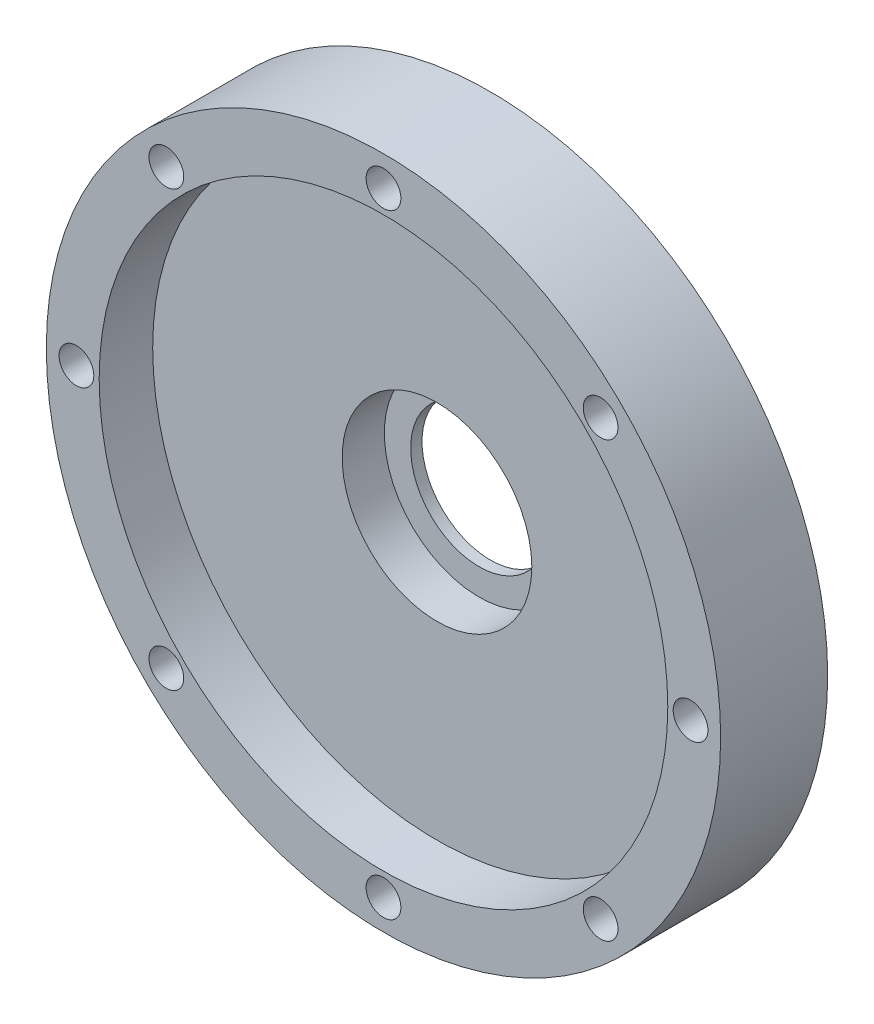
ISO-10303-21;
HEADER;
FILE_DESCRIPTION(('STEP AP214'),'2;1');
FILE_NAME('part.step','',(''),(''),'','','');
FILE_SCHEMA(('AUTOMOTIVE_DESIGN { 1 0 10303 214 1 1 1 1 }'));
ENDSEC;
DATA;
#1=APPLICATION_CONTEXT('core data for automotive mechanical design processes');
#2=APPLICATION_PROTOCOL_DEFINITION('international standard','automotive_design',2000,#1);
#3=PRODUCT_CONTEXT('',#1,'mechanical');
#4=PRODUCT('Part','Part','',(#3));
#5=PRODUCT_RELATED_PRODUCT_CATEGORY('part','',(#4));
#6=PRODUCT_DEFINITION_FORMATION('','',#4);
#7=PRODUCT_DEFINITION_CONTEXT('part definition',#1,'design');
#8=PRODUCT_DEFINITION('design','',#6,#7);
#9=PRODUCT_DEFINITION_SHAPE('','',#8);
#10=(LENGTH_UNIT() NAMED_UNIT(*) SI_UNIT(.MILLI.,.METRE.));
#11=(NAMED_UNIT(*) PLANE_ANGLE_UNIT() SI_UNIT($,.RADIAN.));
#12=(NAMED_UNIT(*) SI_UNIT($,.STERADIAN.) SOLID_ANGLE_UNIT());
#13=UNCERTAINTY_MEASURE_WITH_UNIT(LENGTH_MEASURE(1.E-05),#10,'distance_accuracy_value','');
#14=(GEOMETRIC_REPRESENTATION_CONTEXT(3) GLOBAL_UNCERTAINTY_ASSIGNED_CONTEXT((#13)) GLOBAL_UNIT_ASSIGNED_CONTEXT((#10,
#11,#12)) REPRESENTATION_CONTEXT('',''));
#15=CARTESIAN_POINT('',(0.,0.,0.));
#16=DIRECTION('',(0.,0.,1.));
#17=DIRECTION('',(1.,0.,0.));
#18=AXIS2_PLACEMENT_3D('',#15,#16,#17);
#19=CARTESIAN_POINT('',(0.,0.,10.16));
#20=DIRECTION('',(0.,0.,-1.));
#21=DIRECTION('',(-1.,0.,0.));
#22=AXIS2_PLACEMENT_3D('',#19,#20,#21);
#23=CYLINDRICAL_SURFACE('',#22,32.004);
#24=CARTESIAN_POINT('',(0.,0.,10.16));
#25=DIRECTION('',(0.,0.,1.));
#26=DIRECTION('',(1.,0.,0.));
#27=AXIS2_PLACEMENT_3D('',#24,#25,#26);
#28=CIRCLE('',#27,32.004);
#29=CARTESIAN_POINT('',(32.004,0.,10.16));
#30=VERTEX_POINT('',#29);
#31=EDGE_CURVE('E10',#30,#30,#28,.T.);
#32=ORIENTED_EDGE('',*,*,#31,.F.);
#33=EDGE_LOOP('',(#32));
#34=FACE_BOUND('',#33,.T.);
#35=CARTESIAN_POINT('',(0.,0.,0.));
#36=DIRECTION('',(0.,0.,1.));
#37=DIRECTION('',(1.,0.,0.));
#38=AXIS2_PLACEMENT_3D('',#35,#36,#37);
#39=CIRCLE('',#38,32.004);
#40=CARTESIAN_POINT('',(32.004,0.,0.));
#41=VERTEX_POINT('',#40);
#42=EDGE_CURVE('E50',#41,#41,#39,.T.);
#43=ORIENTED_EDGE('',*,*,#42,.T.);
#44=EDGE_LOOP('',(#43));
#45=FACE_BOUND('',#44,.T.);
#46=ADVANCED_FACE('F47',(#34,#45),#23,.T.);
#47=CARTESIAN_POINT('',(0.,0.,10.16));
#48=DIRECTION('',(0.,0.,1.));
#49=DIRECTION('',(1.,0.,0.));
#50=AXIS2_PLACEMENT_3D('',#47,#48,#49);
#51=PLANE('',#50);
#52=CARTESIAN_POINT('',(0.,29.1465,10.16));
#53=DIRECTION('',(0.,0.,1.));
#54=DIRECTION('',(1.,0.,0.));
#55=AXIS2_PLACEMENT_3D('',#52,#53,#54);
#56=CIRCLE('',#55,1.65);
#57=CARTESIAN_POINT('',(1.65,29.1465,10.16));
#58=VERTEX_POINT('',#57);
#59=EDGE_CURVE('E144',#58,#58,#56,.T.);
#60=ORIENTED_EDGE('',*,*,#59,.F.);
#61=EDGE_LOOP('',(#60));
#62=FACE_BOUND('',#61,.T.);
#63=CARTESIAN_POINT('',(20.6096877978537,20.6096877978537,10.16));
#64=DIRECTION('',(0.,0.,1.));
#65=DIRECTION('',(1.,0.,0.));
#66=AXIS2_PLACEMENT_3D('',#63,#64,#65);
#67=CIRCLE('',#66,1.65);
#68=CARTESIAN_POINT('',(22.2596877978537,20.6096877978537,10.16));
#69=VERTEX_POINT('',#68);
#70=EDGE_CURVE('E136',#69,#69,#67,.T.);
#71=ORIENTED_EDGE('',*,*,#70,.F.);
#72=EDGE_LOOP('',(#71));
#73=FACE_BOUND('',#72,.T.);
#74=CARTESIAN_POINT('',(29.1465,0.,10.16));
#75=DIRECTION('',(0.,0.,1.));
#76=DIRECTION('',(1.,0.,0.));
#77=AXIS2_PLACEMENT_3D('',#74,#75,#76);
#78=CIRCLE('',#77,1.65);
#79=CARTESIAN_POINT('',(30.7965,0.,10.16));
#80=VERTEX_POINT('',#79);
#81=EDGE_CURVE('E128',#80,#80,#78,.T.);
#82=ORIENTED_EDGE('',*,*,#81,.F.);
#83=EDGE_LOOP('',(#82));
#84=FACE_BOUND('',#83,.T.);
#85=CARTESIAN_POINT('',(20.6096877978537,-20.6096877978537,10.16));
#86=DIRECTION('',(0.,0.,1.));
#87=DIRECTION('',(1.,0.,0.));
#88=AXIS2_PLACEMENT_3D('',#85,#86,#87);
#89=CIRCLE('',#88,1.65);
#90=CARTESIAN_POINT('',(22.2596877978537,-20.6096877978537,10.16));
#91=VERTEX_POINT('',#90);
#92=EDGE_CURVE('E120',#91,#91,#89,.T.);
#93=ORIENTED_EDGE('',*,*,#92,.F.);
#94=EDGE_LOOP('',(#93));
#95=FACE_BOUND('',#94,.T.);
#96=CARTESIAN_POINT('',(0.,-29.1465,10.16));
#97=DIRECTION('',(0.,0.,1.));
#98=DIRECTION('',(1.,0.,0.));
#99=AXIS2_PLACEMENT_3D('',#96,#97,#98);
#100=CIRCLE('',#99,1.65);
#101=CARTESIAN_POINT('',(1.65,-29.1465,10.16));
#102=VERTEX_POINT('',#101);
#103=EDGE_CURVE('E112',#102,#102,#100,.T.);
#104=ORIENTED_EDGE('',*,*,#103,.F.);
#105=EDGE_LOOP('',(#104));
#106=FACE_BOUND('',#105,.T.);
#107=CARTESIAN_POINT('',(-20.6096877978537,-20.6096877978537,10.16));
#108=DIRECTION('',(0.,0.,1.));
#109=DIRECTION('',(1.,0.,0.));
#110=AXIS2_PLACEMENT_3D('',#107,#108,#109);
#111=CIRCLE('',#110,1.65);
#112=CARTESIAN_POINT('',(-18.9596877978537,-20.6096877978537,10.16));
#113=VERTEX_POINT('',#112);
#114=EDGE_CURVE('E104',#113,#113,#111,.T.);
#115=ORIENTED_EDGE('',*,*,#114,.F.);
#116=EDGE_LOOP('',(#115));
#117=FACE_BOUND('',#116,.T.);
#118=CARTESIAN_POINT('',(-29.1465,0.,10.16));
#119=DIRECTION('',(0.,0.,1.));
#120=DIRECTION('',(1.,0.,0.));
#121=AXIS2_PLACEMENT_3D('',#118,#119,#120);
#122=CIRCLE('',#121,1.65);
#123=CARTESIAN_POINT('',(-27.4965,0.,10.16));
#124=VERTEX_POINT('',#123);
#125=EDGE_CURVE('E96',#124,#124,#122,.T.);
#126=ORIENTED_EDGE('',*,*,#125,.F.);
#127=EDGE_LOOP('',(#126));
#128=FACE_BOUND('',#127,.T.);
#129=CARTESIAN_POINT('',(-20.6096877978537,20.6096877978537,10.16));
#130=DIRECTION('',(0.,0.,1.));
#131=DIRECTION('',(1.,0.,0.));
#132=AXIS2_PLACEMENT_3D('',#129,#130,#131);
#133=CIRCLE('',#132,1.65);
#134=CARTESIAN_POINT('',(-18.9596877978537,20.6096877978537,10.16));
#135=VERTEX_POINT('',#134);
#136=EDGE_CURVE('E88',#135,#135,#133,.T.);
#137=ORIENTED_EDGE('',*,*,#136,.F.);
#138=EDGE_LOOP('',(#137));
#139=FACE_BOUND('',#138,.T.);
#140=CARTESIAN_POINT('',(0.,0.,10.16));
#141=DIRECTION('',(0.,0.,1.));
#142=DIRECTION('',(1.,0.,0.));
#143=AXIS2_PLACEMENT_3D('',#140,#141,#142);
#144=CIRCLE('',#143,26.9875);
#145=CARTESIAN_POINT('',(26.9875,0.,10.16));
#146=VERTEX_POINT('',#145);
#147=EDGE_CURVE('E61',#146,#146,#144,.T.);
#148=ORIENTED_EDGE('',*,*,#147,.F.);
#149=EDGE_LOOP('',(#148));
#150=FACE_BOUND('',#149,.T.);
#151=ORIENTED_EDGE('',*,*,#31,.T.);
#152=EDGE_LOOP('',(#151));
#153=FACE_BOUND('',#152,.T.);
#154=ADVANCED_FACE('F151',(#62,#73,#84,#95,#106,#117,#128,#139,#150,#153),#51,.T.);
#155=CARTESIAN_POINT('',(0.,0.,0.));
#156=DIRECTION('',(0.,0.,1.));
#157=DIRECTION('',(1.,0.,0.));
#158=AXIS2_PLACEMENT_3D('',#155,#156,#157);
#159=PLANE('',#158);
#160=CARTESIAN_POINT('',(0.,29.1465,0.));
#161=DIRECTION('',(0.,0.,1.));
#162=DIRECTION('',(1.,0.,0.));
#163=AXIS2_PLACEMENT_3D('',#160,#161,#162);
#164=CIRCLE('',#163,1.65);
#165=CARTESIAN_POINT('',(1.65,29.1465,0.));
#166=VERTEX_POINT('',#165);
#167=EDGE_CURVE('E140',#166,#166,#164,.T.);
#168=ORIENTED_EDGE('',*,*,#167,.T.);
#169=EDGE_LOOP('',(#168));
#170=FACE_BOUND('',#169,.T.);
#171=CARTESIAN_POINT('',(20.6096877978537,20.6096877978537,0.));
#172=DIRECTION('',(0.,0.,1.));
#173=DIRECTION('',(1.,0.,0.));
#174=AXIS2_PLACEMENT_3D('',#171,#172,#173);
#175=CIRCLE('',#174,1.65);
#176=CARTESIAN_POINT('',(22.2596877978537,20.6096877978537,0.));
#177=VERTEX_POINT('',#176);
#178=EDGE_CURVE('E132',#177,#177,#175,.T.);
#179=ORIENTED_EDGE('',*,*,#178,.T.);
#180=EDGE_LOOP('',(#179));
#181=FACE_BOUND('',#180,.T.);
#182=CARTESIAN_POINT('',(29.1465,0.,0.));
#183=DIRECTION('',(0.,0.,1.));
#184=DIRECTION('',(1.,0.,0.));
#185=AXIS2_PLACEMENT_3D('',#182,#183,#184);
#186=CIRCLE('',#185,1.65);
#187=CARTESIAN_POINT('',(30.7965,0.,0.));
#188=VERTEX_POINT('',#187);
#189=EDGE_CURVE('E124',#188,#188,#186,.T.);
#190=ORIENTED_EDGE('',*,*,#189,.T.);
#191=EDGE_LOOP('',(#190));
#192=FACE_BOUND('',#191,.T.);
#193=CARTESIAN_POINT('',(20.6096877978537,-20.6096877978537,0.));
#194=DIRECTION('',(0.,0.,1.));
#195=DIRECTION('',(1.,0.,0.));
#196=AXIS2_PLACEMENT_3D('',#193,#194,#195);
#197=CIRCLE('',#196,1.65);
#198=CARTESIAN_POINT('',(22.2596877978537,-20.6096877978537,0.));
#199=VERTEX_POINT('',#198);
#200=EDGE_CURVE('E116',#199,#199,#197,.T.);
#201=ORIENTED_EDGE('',*,*,#200,.T.);
#202=EDGE_LOOP('',(#201));
#203=FACE_BOUND('',#202,.T.);
#204=CARTESIAN_POINT('',(0.,-29.1465,0.));
#205=DIRECTION('',(0.,0.,1.));
#206=DIRECTION('',(1.,0.,0.));
#207=AXIS2_PLACEMENT_3D('',#204,#205,#206);
#208=CIRCLE('',#207,1.65);
#209=CARTESIAN_POINT('',(1.65,-29.1465,0.));
#210=VERTEX_POINT('',#209);
#211=EDGE_CURVE('E108',#210,#210,#208,.T.);
#212=ORIENTED_EDGE('',*,*,#211,.T.);
#213=EDGE_LOOP('',(#212));
#214=FACE_BOUND('',#213,.T.);
#215=CARTESIAN_POINT('',(-20.6096877978537,-20.6096877978537,0.));
#216=DIRECTION('',(0.,0.,1.));
#217=DIRECTION('',(1.,0.,0.));
#218=AXIS2_PLACEMENT_3D('',#215,#216,#217);
#219=CIRCLE('',#218,1.65);
#220=CARTESIAN_POINT('',(-18.9596877978537,-20.6096877978537,0.));
#221=VERTEX_POINT('',#220);
#222=EDGE_CURVE('E100',#221,#221,#219,.T.);
#223=ORIENTED_EDGE('',*,*,#222,.T.);
#224=EDGE_LOOP('',(#223));
#225=FACE_BOUND('',#224,.T.);
#226=CARTESIAN_POINT('',(-29.1465,0.,0.));
#227=DIRECTION('',(0.,0.,1.));
#228=DIRECTION('',(1.,0.,0.));
#229=AXIS2_PLACEMENT_3D('',#226,#227,#228);
#230=CIRCLE('',#229,1.65);
#231=CARTESIAN_POINT('',(-27.4965,0.,0.));
#232=VERTEX_POINT('',#231);
#233=EDGE_CURVE('E92',#232,#232,#230,.T.);
#234=ORIENTED_EDGE('',*,*,#233,.T.);
#235=EDGE_LOOP('',(#234));
#236=FACE_BOUND('',#235,.T.);
#237=CARTESIAN_POINT('',(-20.6096877978537,20.6096877978537,0.));
#238=DIRECTION('',(0.,0.,1.));
#239=DIRECTION('',(1.,0.,0.));
#240=AXIS2_PLACEMENT_3D('',#237,#238,#239);
#241=CIRCLE('',#240,1.65);
#242=CARTESIAN_POINT('',(-18.9596877978537,20.6096877978537,0.));
#243=VERTEX_POINT('',#242);
#244=EDGE_CURVE('E81',#243,#243,#241,.T.);
#245=ORIENTED_EDGE('',*,*,#244,.T.);
#246=EDGE_LOOP('',(#245));
#247=FACE_BOUND('',#246,.T.);
#248=CARTESIAN_POINT('',(0.,0.,0.));
#249=DIRECTION('',(0.,0.,1.));
#250=DIRECTION('',(1.,0.,0.));
#251=AXIS2_PLACEMENT_3D('',#248,#249,#250);
#252=CIRCLE('',#251,6.5);
#253=CARTESIAN_POINT('',(6.5,0.,0.));
#254=VERTEX_POINT('',#253);
#255=EDGE_CURVE('E73',#254,#254,#252,.T.);
#256=ORIENTED_EDGE('',*,*,#255,.T.);
#257=EDGE_LOOP('',(#256));
#258=FACE_BOUND('',#257,.T.);
#259=ORIENTED_EDGE('',*,*,#42,.F.);
#260=EDGE_LOOP('',(#259));
#261=FACE_BOUND('',#260,.T.);
#262=ADVANCED_FACE('F154',(#170,#181,#192,#203,#214,#225,#236,#247,#258,#261),#159,.F.);
#263=CARTESIAN_POINT('',(0.,0.,5.08));
#264=DIRECTION('',(0.,0.,1.));
#265=DIRECTION('',(1.,0.,0.));
#266=AXIS2_PLACEMENT_3D('',#263,#264,#265);
#267=CYLINDRICAL_SURFACE('',#266,26.9875);
#268=CARTESIAN_POINT('',(0.,0.,5.08));
#269=DIRECTION('',(0.,0.,1.));
#270=DIRECTION('',(1.,0.,0.));
#271=AXIS2_PLACEMENT_3D('',#268,#269,#270);
#272=CIRCLE('',#271,26.9875);
#273=CARTESIAN_POINT('',(26.9875,0.,5.08));
#274=VERTEX_POINT('',#273);
#275=EDGE_CURVE('E59',#274,#274,#272,.T.);
#276=ORIENTED_EDGE('',*,*,#275,.F.);
#277=EDGE_LOOP('',(#276));
#278=FACE_BOUND('',#277,.T.);
#279=ORIENTED_EDGE('',*,*,#147,.T.);
#280=EDGE_LOOP('',(#279));
#281=FACE_BOUND('',#280,.T.);
#282=ADVANCED_FACE('F172',(#278,#281),#267,.F.);
#283=CARTESIAN_POINT('',(0.,0.,5.08));
#284=DIRECTION('',(0.,0.,1.));
#285=DIRECTION('',(1.,0.,0.));
#286=AXIS2_PLACEMENT_3D('',#283,#284,#285);
#287=PLANE('',#286);
#288=CARTESIAN_POINT('',(0.,0.,5.08));
#289=DIRECTION('',(0.,0.,1.));
#290=DIRECTION('',(1.,0.,0.));
#291=AXIS2_PLACEMENT_3D('',#288,#289,#290);
#292=CIRCLE('',#291,9.);
#293=CARTESIAN_POINT('',(9.,0.,5.08));
#294=VERTEX_POINT('',#293);
#295=EDGE_CURVE('E69',#294,#294,#292,.T.);
#296=ORIENTED_EDGE('',*,*,#295,.F.);
#297=EDGE_LOOP('',(#296));
#298=FACE_BOUND('',#297,.T.);
#299=ORIENTED_EDGE('',*,*,#275,.T.);
#300=EDGE_LOOP('',(#299));
#301=FACE_BOUND('',#300,.T.);
#302=ADVANCED_FACE('F174',(#298,#301),#287,.T.);
#303=CARTESIAN_POINT('',(0.,0.,1.08));
#304=DIRECTION('',(0.,0.,1.));
#305=DIRECTION('',(1.,0.,0.));
#306=AXIS2_PLACEMENT_3D('',#303,#304,#305);
#307=CYLINDRICAL_SURFACE('',#306,9.);
#308=CARTESIAN_POINT('',(0.,0.,1.08));
#309=DIRECTION('',(0.,0.,1.));
#310=DIRECTION('',(1.,0.,0.));
#311=AXIS2_PLACEMENT_3D('',#308,#309,#310);
#312=CIRCLE('',#311,9.);
#313=CARTESIAN_POINT('',(9.,0.,1.08));
#314=VERTEX_POINT('',#313);
#315=EDGE_CURVE('E65',#314,#314,#312,.T.);
#316=ORIENTED_EDGE('',*,*,#315,.F.);
#317=EDGE_LOOP('',(#316));
#318=FACE_BOUND('',#317,.T.);
#319=ORIENTED_EDGE('',*,*,#295,.T.);
#320=EDGE_LOOP('',(#319));
#321=FACE_BOUND('',#320,.T.);
#322=ADVANCED_FACE('F181',(#318,#321),#307,.F.);
#323=CARTESIAN_POINT('',(0.,0.,1.08));
#324=DIRECTION('',(0.,0.,1.));
#325=DIRECTION('',(1.,0.,0.));
#326=AXIS2_PLACEMENT_3D('',#323,#324,#325);
#327=PLANE('',#326);
#328=CARTESIAN_POINT('',(0.,0.,1.08));
#329=DIRECTION('',(0.,0.,1.));
#330=DIRECTION('',(1.,0.,0.));
#331=AXIS2_PLACEMENT_3D('',#328,#329,#330);
#332=CIRCLE('',#331,6.5);
#333=CARTESIAN_POINT('',(6.5,0.,1.08));
#334=VERTEX_POINT('',#333);
#335=EDGE_CURVE('E77',#334,#334,#332,.T.);
#336=ORIENTED_EDGE('',*,*,#335,.F.);
#337=EDGE_LOOP('',(#336));
#338=FACE_BOUND('',#337,.T.);
#339=ORIENTED_EDGE('',*,*,#315,.T.);
#340=EDGE_LOOP('',(#339));
#341=FACE_BOUND('',#340,.T.);
#342=ADVANCED_FACE('F229',(#338,#341),#327,.T.);
#343=CARTESIAN_POINT('',(0.,0.,0.));
#344=DIRECTION('',(0.,0.,1.));
#345=DIRECTION('',(1.,0.,0.));
#346=AXIS2_PLACEMENT_3D('',#343,#344,#345);
#347=CYLINDRICAL_SURFACE('',#346,6.5);
#348=ORIENTED_EDGE('',*,*,#255,.F.);
#349=EDGE_LOOP('',(#348));
#350=FACE_BOUND('',#349,.T.);
#351=ORIENTED_EDGE('',*,*,#335,.T.);
#352=EDGE_LOOP('',(#351));
#353=FACE_BOUND('',#352,.T.);
#354=ADVANCED_FACE('F239',(#350,#353),#347,.F.);
#355=CARTESIAN_POINT('',(-20.6096877978537,20.6096877978537,10.16));
#356=DIRECTION('',(0.,0.,1.));
#357=DIRECTION('',(1.,0.,0.));
#358=AXIS2_PLACEMENT_3D('',#355,#356,#357);
#359=CYLINDRICAL_SURFACE('',#358,1.65);
#360=ORIENTED_EDGE('',*,*,#244,.F.);
#361=EDGE_LOOP('',(#360));
#362=FACE_BOUND('',#361,.T.);
#363=ORIENTED_EDGE('',*,*,#136,.T.);
#364=EDGE_LOOP('',(#363));
#365=FACE_BOUND('',#364,.T.);
#366=ADVANCED_FACE('F248',(#362,#365),#359,.F.);
#367=CARTESIAN_POINT('',(-29.1465,0.,10.16));
#368=DIRECTION('',(0.,0.,1.));
#369=DIRECTION('',(1.,0.,0.));
#370=AXIS2_PLACEMENT_3D('',#367,#368,#369);
#371=CYLINDRICAL_SURFACE('',#370,1.65);
#372=ORIENTED_EDGE('',*,*,#233,.F.);
#373=EDGE_LOOP('',(#372));
#374=FACE_BOUND('',#373,.T.);
#375=ORIENTED_EDGE('',*,*,#125,.T.);
#376=EDGE_LOOP('',(#375));
#377=FACE_BOUND('',#376,.T.);
#378=ADVANCED_FACE('F258',(#374,#377),#371,.F.);
#379=CARTESIAN_POINT('',(-20.6096877978537,-20.6096877978537,10.16));
#380=DIRECTION('',(0.,0.,1.));
#381=DIRECTION('',(1.,0.,0.));
#382=AXIS2_PLACEMENT_3D('',#379,#380,#381);
#383=CYLINDRICAL_SURFACE('',#382,1.65);
#384=ORIENTED_EDGE('',*,*,#222,.F.);
#385=EDGE_LOOP('',(#384));
#386=FACE_BOUND('',#385,.T.);
#387=ORIENTED_EDGE('',*,*,#114,.T.);
#388=EDGE_LOOP('',(#387));
#389=FACE_BOUND('',#388,.T.);
#390=ADVANCED_FACE('F270',(#386,#389),#383,.F.);
#391=CARTESIAN_POINT('',(0.,-29.1465,10.16));
#392=DIRECTION('',(0.,0.,1.));
#393=DIRECTION('',(1.,0.,0.));
#394=AXIS2_PLACEMENT_3D('',#391,#392,#393);
#395=CYLINDRICAL_SURFACE('',#394,1.65);
#396=ORIENTED_EDGE('',*,*,#211,.F.);
#397=EDGE_LOOP('',(#396));
#398=FACE_BOUND('',#397,.T.);
#399=ORIENTED_EDGE('',*,*,#103,.T.);
#400=EDGE_LOOP('',(#399));
#401=FACE_BOUND('',#400,.T.);
#402=ADVANCED_FACE('F282',(#398,#401),#395,.F.);
#403=CARTESIAN_POINT('',(20.6096877978537,-20.6096877978537,10.16));
#404=DIRECTION('',(0.,0.,1.));
#405=DIRECTION('',(1.,0.,0.));
#406=AXIS2_PLACEMENT_3D('',#403,#404,#405);
#407=CYLINDRICAL_SURFACE('',#406,1.65);
#408=ORIENTED_EDGE('',*,*,#200,.F.);
#409=EDGE_LOOP('',(#408));
#410=FACE_BOUND('',#409,.T.);
#411=ORIENTED_EDGE('',*,*,#92,.T.);
#412=EDGE_LOOP('',(#411));
#413=FACE_BOUND('',#412,.T.);
#414=ADVANCED_FACE('F294',(#410,#413),#407,.F.);
#415=CARTESIAN_POINT('',(29.1465,0.,10.16));
#416=DIRECTION('',(0.,0.,1.));
#417=DIRECTION('',(1.,0.,0.));
#418=AXIS2_PLACEMENT_3D('',#415,#416,#417);
#419=CYLINDRICAL_SURFACE('',#418,1.65);
#420=ORIENTED_EDGE('',*,*,#189,.F.);
#421=EDGE_LOOP('',(#420));
#422=FACE_BOUND('',#421,.T.);
#423=ORIENTED_EDGE('',*,*,#81,.T.);
#424=EDGE_LOOP('',(#423));
#425=FACE_BOUND('',#424,.T.);
#426=ADVANCED_FACE('F306',(#422,#425),#419,.F.);
#427=CARTESIAN_POINT('',(20.6096877978537,20.6096877978537,10.16));
#428=DIRECTION('',(0.,0.,1.));
#429=DIRECTION('',(1.,0.,0.));
#430=AXIS2_PLACEMENT_3D('',#427,#428,#429);
#431=CYLINDRICAL_SURFACE('',#430,1.65);
#432=ORIENTED_EDGE('',*,*,#178,.F.);
#433=EDGE_LOOP('',(#432));
#434=FACE_BOUND('',#433,.T.);
#435=ORIENTED_EDGE('',*,*,#70,.T.);
#436=EDGE_LOOP('',(#435));
#437=FACE_BOUND('',#436,.T.);
#438=ADVANCED_FACE('F318',(#434,#437),#431,.F.);
#439=CARTESIAN_POINT('',(0.,29.1465,10.16));
#440=DIRECTION('',(0.,0.,1.));
#441=DIRECTION('',(1.,0.,0.));
#442=AXIS2_PLACEMENT_3D('',#439,#440,#441);
#443=CYLINDRICAL_SURFACE('',#442,1.65);
#444=ORIENTED_EDGE('',*,*,#167,.F.);
#445=EDGE_LOOP('',(#444));
#446=FACE_BOUND('',#445,.T.);
#447=ORIENTED_EDGE('',*,*,#59,.T.);
#448=EDGE_LOOP('',(#447));
#449=FACE_BOUND('',#448,.T.);
#450=ADVANCED_FACE('F149',(#446,#449),#443,.F.);
#451=CLOSED_SHELL('',(#46,#154,#262,#282,#302,#322,#342,#354,#366,#378,#390,#402,#414,#426,#438,#450));
#452=MANIFOLD_SOLID_BREP('B2',#451);
#453=ADVANCED_BREP_SHAPE_REPRESENTATION('',(#18,#452),#14);
#454=SHAPE_DEFINITION_REPRESENTATION(#9,#453);
ENDSEC;
END-ISO-10303-21;
